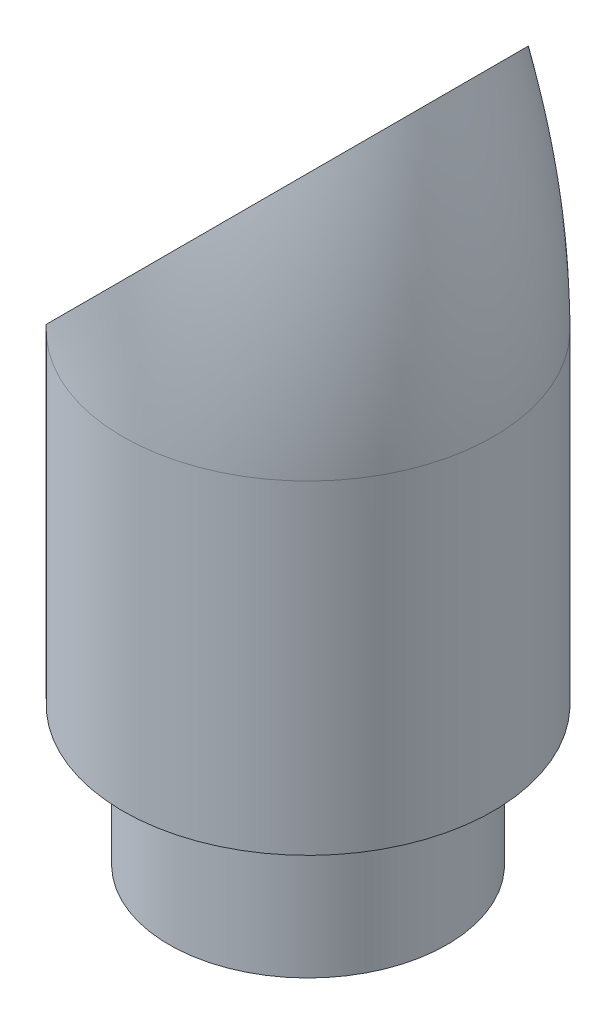
ISO-10303-21;
HEADER;
FILE_DESCRIPTION(('STEP AP214'),'2;1');
FILE_NAME('part.step','',(''),(''),'','','');
FILE_SCHEMA(('AUTOMOTIVE_DESIGN { 1 0 10303 214 1 1 1 1 }'));
ENDSEC;
DATA;
#1=APPLICATION_CONTEXT('core data for automotive mechanical design processes');
#2=APPLICATION_PROTOCOL_DEFINITION('international standard','automotive_design',2000,#1);
#3=PRODUCT_CONTEXT('',#1,'mechanical');
#4=PRODUCT('Part','Part','',(#3));
#5=PRODUCT_RELATED_PRODUCT_CATEGORY('part','',(#4));
#6=PRODUCT_DEFINITION_FORMATION('','',#4);
#7=PRODUCT_DEFINITION_CONTEXT('part definition',#1,'design');
#8=PRODUCT_DEFINITION('design','',#6,#7);
#9=PRODUCT_DEFINITION_SHAPE('','',#8);
#10=(LENGTH_UNIT() NAMED_UNIT(*) SI_UNIT(.MILLI.,.METRE.));
#11=(NAMED_UNIT(*) PLANE_ANGLE_UNIT() SI_UNIT($,.RADIAN.));
#12=(NAMED_UNIT(*) SI_UNIT($,.STERADIAN.) SOLID_ANGLE_UNIT());
#13=UNCERTAINTY_MEASURE_WITH_UNIT(LENGTH_MEASURE(1.E-05),#10,'distance_accuracy_value','');
#14=(GEOMETRIC_REPRESENTATION_CONTEXT(3) GLOBAL_UNCERTAINTY_ASSIGNED_CONTEXT((#13)) GLOBAL_UNIT_ASSIGNED_CONTEXT((#10,
#11,#12)) REPRESENTATION_CONTEXT('',''));
#15=CARTESIAN_POINT('',(0.,0.,0.));
#16=DIRECTION('',(0.,0.,1.));
#17=DIRECTION('',(1.,0.,0.));
#18=AXIS2_PLACEMENT_3D('',#15,#16,#17);
#19=CARTESIAN_POINT('',(0.,10.,0.));
#20=DIRECTION('',(0.,-1.,0.));
#21=DIRECTION('',(0.,0.,-1.));
#22=AXIS2_PLACEMENT_3D('',#19,#20,#21);
#23=PLANE('',#22);
#24=CARTESIAN_POINT('',(0.,10.,0.));
#25=DIRECTION('',(0.,-1.,0.));
#26=DIRECTION('',(0.,0.,-1.));
#27=AXIS2_PLACEMENT_3D('',#24,#25,#26);
#28=CIRCLE('',#27,1.6);
#29=CARTESIAN_POINT('',(0.,10.,-1.6));
#30=VERTEX_POINT('',#29);
#31=EDGE_CURVE('E82',#30,#30,#28,.T.);
#32=ORIENTED_EDGE('',*,*,#31,.T.);
#33=EDGE_LOOP('',(#32));
#34=FACE_BOUND('',#33,.T.);
#35=ADVANCED_FACE('F39',(#34),#23,.T.);
#36=CARTESIAN_POINT('',(0.,10.,0.));
#37=DIRECTION('',(0.,-1.,0.));
#38=DIRECTION('',(0.,0.,-1.));
#39=AXIS2_PLACEMENT_3D('',#36,#37,#38);
#40=CYLINDRICAL_SURFACE('',#39,1.6);
#41=ORIENTED_EDGE('',*,*,#31,.F.);
#42=EDGE_LOOP('',(#41));
#43=FACE_BOUND('',#42,.T.);
#44=CARTESIAN_POINT('',(0.,0.,0.));
#45=DIRECTION('',(0.,-1.,0.));
#46=DIRECTION('',(0.,0.,-1.));
#47=AXIS2_PLACEMENT_3D('',#44,#45,#46);
#48=CIRCLE('',#47,1.6);
#49=CARTESIAN_POINT('',(0.,0.,-1.6));
#50=VERTEX_POINT('',#49);
#51=EDGE_CURVE('E68',#50,#50,#48,.T.);
#52=ORIENTED_EDGE('',*,*,#51,.T.);
#53=EDGE_LOOP('',(#52));
#54=FACE_BOUND('',#53,.T.);
#55=ADVANCED_FACE('F94',(#43,#54),#40,.F.);
#56=CARTESIAN_POINT('',(0.,0.,0.));
#57=DIRECTION('',(0.,1.,0.));
#58=DIRECTION('',(0.,0.,1.));
#59=AXIS2_PLACEMENT_3D('',#56,#57,#58);
#60=PLANE('',#59);
#61=ORIENTED_EDGE('',*,*,#51,.F.);
#62=EDGE_LOOP('',(#61));
#63=FACE_BOUND('',#62,.T.);
#64=CARTESIAN_POINT('',(0.,0.,0.));
#65=DIRECTION('',(0.,-1.,0.));
#66=DIRECTION('',(0.,0.,-1.));
#67=AXIS2_PLACEMENT_3D('',#64,#65,#66);
#68=CIRCLE('',#67,3.);
#69=CARTESIAN_POINT('',(0.,0.,-3.));
#70=VERTEX_POINT('',#69);
#71=EDGE_CURVE('E78',#70,#70,#68,.T.);
#72=ORIENTED_EDGE('',*,*,#71,.T.);
#73=EDGE_LOOP('',(#72));
#74=FACE_BOUND('',#73,.T.);
#75=ADVANCED_FACE('F41',(#63,#74),#60,.F.);
#76=CARTESIAN_POINT('',(0.,3.,0.));
#77=DIRECTION('',(0.,-1.,0.));
#78=DIRECTION('',(0.,0.,-1.));
#79=AXIS2_PLACEMENT_3D('',#76,#77,#78);
#80=CYLINDRICAL_SURFACE('',#79,3.);
#81=CARTESIAN_POINT('',(0.,3.,0.));
#82=DIRECTION('',(0.,-1.,0.));
#83=DIRECTION('',(0.,0.,-1.));
#84=AXIS2_PLACEMENT_3D('',#81,#82,#83);
#85=CIRCLE('',#84,3.);
#86=CARTESIAN_POINT('',(0.,3.,-3.));
#87=VERTEX_POINT('',#86);
#88=EDGE_CURVE('E75',#87,#87,#85,.T.);
#89=ORIENTED_EDGE('',*,*,#88,.T.);
#90=EDGE_LOOP('',(#89));
#91=FACE_BOUND('',#90,.T.);
#92=ORIENTED_EDGE('',*,*,#71,.F.);
#93=EDGE_LOOP('',(#92));
#94=FACE_BOUND('',#93,.T.);
#95=ADVANCED_FACE('F102',(#91,#94),#80,.T.);
#96=CARTESIAN_POINT('',(0.,3.,0.));
#97=DIRECTION('',(0.,-1.,0.));
#98=DIRECTION('',(0.,0.,-1.));
#99=AXIS2_PLACEMENT_3D('',#96,#97,#98);
#100=PLANE('',#99);
#101=ORIENTED_EDGE('',*,*,#88,.F.);
#102=EDGE_LOOP('',(#101));
#103=FACE_BOUND('',#102,.T.);
#104=CARTESIAN_POINT('',(0.,3.,0.));
#105=DIRECTION('',(0.,-1.,0.));
#106=DIRECTION('',(0.,0.,-1.));
#107=AXIS2_PLACEMENT_3D('',#104,#105,#106);
#108=CIRCLE('',#107,4.);
#109=CARTESIAN_POINT('',(0.,3.,-4.));
#110=VERTEX_POINT('',#109);
#111=EDGE_CURVE('E72',#110,#110,#108,.T.);
#112=ORIENTED_EDGE('',*,*,#111,.T.);
#113=EDGE_LOOP('',(#112));
#114=FACE_BOUND('',#113,.T.);
#115=ADVANCED_FACE('F106',(#103,#114),#100,.T.);
#116=CARTESIAN_POINT('',(-10.,10.,0.));
#117=DIRECTION('',(0.,0.,1.));
#118=DIRECTION('',(1.,0.,0.));
#119=AXIS2_PLACEMENT_3D('',#116,#117,#118);
#120=TOROIDAL_SURFACE('',#119,10.,4.);
#121=CARTESIAN_POINT('',(-2.92913218813445,9.9998,2.72400158608706));
#122=CARTESIAN_POINT('',(-2.88158386871908,10.0473483194154,2.7751235192713));
#123=CARTESIAN_POINT('',(-2.83330709685542,10.095625091279,2.82487186485206));
#124=CARTESIAN_POINT('',(-2.73538819465078,10.1935439934837,2.92159553685329));
#125=CARTESIAN_POINT('',(-2.685746149424,10.2431860387104,2.96857103556741));
#126=CARTESIAN_POINT('',(-2.53490572031278,10.3940264678217,3.1053039532406));
#127=CARTESIAN_POINT('',(-2.43178798389395,10.4971442042405,3.19087321768191));
#128=CARTESIAN_POINT('',(-2.22042558816401,10.7085065999705,3.35088564511748));
#129=CARTESIAN_POINT('',(-2.11215064402035,10.8167815441141,3.42524856610438));
#130=CARTESIAN_POINT('',(-1.89173835735942,11.037193830775,3.56151658046738));
#131=CARTESIAN_POINT('',(-1.77960090920685,11.1493312789276,3.62342133280876));
#132=CARTESIAN_POINT('',(-1.54530934463143,11.383622843503,3.73731465571493));
#133=CARTESIAN_POINT('',(-1.42295682301914,11.5059753651153,3.78849099694701));
#134=CARTESIAN_POINT('',(-1.17548329287618,11.7534488952583,3.87500879943194));
#135=CARTESIAN_POINT('',(-1.05036257320204,11.8785696149324,3.91035190475291));
#136=CARTESIAN_POINT('',(-0.798664054347544,12.1302681337869,3.96412494210877));
#137=CARTESIAN_POINT('',(-0.672091353248427,12.256840834886,3.98260224268132));
#138=CARTESIAN_POINT('',(-0.418283668642859,12.5106485194916,4.00184224684836));
#139=CARTESIAN_POINT('',(-0.291048919216336,12.6378832689181,4.00261083560131));
#140=CARTESIAN_POINT('',(-0.068652101036781,12.8602800870977,3.98770779226967));
#141=CARTESIAN_POINT('',(0.026651577781745,12.9555837659162,3.97605930903689));
#142=CARTESIAN_POINT('',(0.216283358359402,13.1452155464939,3.94196996418251));
#143=CARTESIAN_POINT('',(0.310611651133643,13.2395438392681,3.91953125818385));
#144=CARTESIAN_POINT('',(0.49766152373884,13.4265937118733,3.86362840285947));
#145=CARTESIAN_POINT('',(0.590382517694651,13.5193147058291,3.83016031862292));
#146=CARTESIAN_POINT('',(0.773410462789536,13.702342650924,3.75209168535014));
#147=CARTESIAN_POINT('',(0.863718554557266,13.7926507426918,3.70749650322012));
#148=CARTESIAN_POINT('',(1.04172095477024,13.9706531429047,3.60685052347462));
#149=CARTESIAN_POINT('',(1.12939638958422,14.0583285777187,3.55073277535716));
#150=CARTESIAN_POINT('',(1.30069509479289,14.2296272829274,3.42735612085403));
#151=CARTESIAN_POINT('',(1.38432019025806,14.3132523783926,3.36010229386681));
#152=CARTESIAN_POINT('',(1.54669772416968,14.4756299123042,3.21471507728015));
#153=CARTESIAN_POINT('',(1.62545060011529,14.5543827882498,3.13658266657304));
#154=CARTESIAN_POINT('',(1.77722103118634,14.7061532193208,2.96987545736534));
#155=CARTESIAN_POINT('',(1.85023929160725,14.7791714797418,2.8813019463685));
#156=CARTESIAN_POINT('',(1.98241379018344,14.9113459783179,2.70408513615778));
#157=CARTESIAN_POINT('',(2.04222154951238,14.9711537376469,2.61641211041904));
#158=CARTESIAN_POINT('',(2.15595906234872,15.0848912504832,2.43375031968733));
#159=CARTESIAN_POINT('',(2.2098894805048,15.1388216686393,2.33876238399056));
#160=CARTESIAN_POINT('',(2.31129353089334,15.2402257190279,2.14218737374556));
#161=CARTESIAN_POINT('',(2.35877001629223,15.2877022044267,2.04060324479647));
#162=CARTESIAN_POINT('',(2.44677974377143,15.3757119319059,1.83158675937055));
#163=CARTESIAN_POINT('',(2.48731344243624,15.4162456305708,1.72415478808322));
#164=CARTESIAN_POINT('',(2.55786798678361,15.4868001749181,1.51363775564445));
#165=CARTESIAN_POINT('',(2.58848800992881,15.5174201980633,1.41095346133786));
#166=CARTESIAN_POINT('',(2.64324767036999,15.5721798585045,1.20214105494086));
#167=CARTESIAN_POINT('',(2.66738517481277,15.5963173629473,1.09601182225173));
#168=CARTESIAN_POINT('',(2.70891369961571,15.6378458877502,0.881218279840907));
#169=CARTESIAN_POINT('',(2.72630905218914,15.6552412403237,0.772555645725129));
#170=CARTESIAN_POINT('',(2.75420662958353,15.6831388177181,0.553431501953455));
#171=CARTESIAN_POINT('',(2.76470638119587,15.6936385693304,0.442969361419416));
#172=CARTESIAN_POINT('',(2.77837738569992,15.7073095738344,0.226225852343533));
#173=CARTESIAN_POINT('',(2.78186113319236,15.7107933213269,0.119983667962317));
#174=CARTESIAN_POINT('',(2.78241313861938,15.7113453267539,-0.0925732522418554));
#175=CARTESIAN_POINT('',(2.77947911250278,15.7084113006373,-0.198888000428563));
#176=CARTESIAN_POINT('',(2.76722053776811,15.6961527259026,-0.410726332607123));
#177=CARTESIAN_POINT('',(2.75789904447095,15.6868312326055,-0.516250270482169));
#178=CARTESIAN_POINT('',(2.73295106361706,15.6618832517516,-0.725834634159517));
#179=CARTESIAN_POINT('',(2.71732224622291,15.6462544343574,-0.829894504440631));
#180=CARTESIAN_POINT('',(2.6800942302071,15.6090264183416,-1.0347028516346));
#181=CARTESIAN_POINT('',(2.65855903106732,15.5874912192018,-1.13547455134927));
#182=CARTESIAN_POINT('',(2.60964607834053,15.538578266475,-1.33415279223178));
#183=CARTESIAN_POINT('',(2.58226622253591,15.5111984106704,-1.43205828803103));
#184=CARTESIAN_POINT('',(2.49170736547634,15.4206395536109,-1.72041258490721));
#185=CARTESIAN_POINT('',(2.4200714896984,15.3490036778329,-1.90570410185356));
#186=CARTESIAN_POINT('',(2.25493188373942,15.1838640718739,-2.26134650362618));
#187=CARTESIAN_POINT('',(2.16098214811302,15.0899143362475,-2.43127952610891));
#188=CARTESIAN_POINT('',(1.9551539335176,14.8840861216521,-2.74781474210799));
#189=CARTESIAN_POINT('',(1.84327234437422,14.7722045325087,-2.89441287951852));
#190=CARTESIAN_POINT('',(1.59866938794935,14.5276015760839,-3.16854455397865));
#191=CARTESIAN_POINT('',(1.46516215628635,14.3940943444209,-3.29467257106373));
#192=CARTESIAN_POINT('',(1.1859921661381,14.1149243542726,-3.51620646760122));
#193=CARTESIAN_POINT('',(1.04032566622048,13.969257854355,-3.61160284666137));
#194=CARTESIAN_POINT('',(0.728250643516532,13.657182831651,-3.77763612839992));
#195=CARTESIAN_POINT('',(0.561123668219778,13.4900558563543,-3.8455650903559));
#196=CARTESIAN_POINT('',(0.221610603233747,13.1505427913682,-3.94515610809312));
#197=CARTESIAN_POINT('',(0.0492230111352769,12.9781551992698,-3.97680770179299));
#198=CARTESIAN_POINT('',(-0.316565175889688,12.6123670122448,-4.00700052907749));
#199=CARTESIAN_POINT('',(-0.510134784507242,12.4187974036272,-4.00138664338646));
#200=CARTESIAN_POINT('',(-0.894648693344993,12.0342834947895,-3.95017483781599));
#201=CARTESIAN_POINT('',(-1.08559056327836,11.8433416248561,-3.90454213937303));
#202=CARTESIAN_POINT('',(-1.487677256622,11.4412549315125,-3.76776437083939));
#203=CARTESIAN_POINT('',(-1.697880984652,11.2310512034825,-3.67111550181158));
#204=CARTESIAN_POINT('',(-2.1058595461113,10.8230726420232,-3.43534051279573));
#205=CARTESIAN_POINT('',(-2.30364227631728,10.6252899118172,-3.29624171727975));
#206=CARTESIAN_POINT('',(-2.56869110600292,10.3602410821315,-3.07492592879239));
#207=CARTESIAN_POINT('',(-2.64287786671807,10.2860543214164,-3.00884839966487));
#208=CARTESIAN_POINT('',(-2.78826329918973,10.1406688889447,-2.87082291167029));
#209=CARTESIAN_POINT('',(-2.85946737816799,10.0694648099665,-2.79888633988227));
#210=CARTESIAN_POINT('',(-2.92913218813445,9.9998,-2.72400158608706));
#211=B_SPLINE_CURVE_WITH_KNOTS('',3,(#121,#122,#123,#124,#125,#126,#127,#128,#129,#130,#131,
#132,#133,#134,#135,#136,#137,#138,#139,#140,#141,#142,#143,#144,#145,#146,#147,#148,#149,#150,
#151,#152,#153,#154,#155,#156,#157,#158,#159,#160,#161,#162,#163,#164,#165,#166,#167,#168,#169,
#170,#171,#172,#173,#174,#175,#176,#177,#178,#179,#180,#181,#182,#183,#184,#185,#186,#187,#188,
#189,#190,#191,#192,#193,#194,#195,#196,#197,#198,#199,#200,#201,#202,#203,#204,#205,#206,#207,
#208,#209,#210),.UNSPECIFIED.,.F.,.F.,(4,2,2,2,2,2,2,2,2,2,2,2,2,2,2,2,2,2,2,2,2,2,2,2,2,2,2,2,
2,2,2,2,2,2,2,2,2,2,2,2,2,2,2,2,4),(0.,0.253370642160092,0.506725524270874,1.01340843011633,
1.52356265310228,2.03373083934824,2.57434425031388,3.11490151284597,3.65393587701449,
4.19279110063018,4.5982368740317,5.00360168290011,5.4091112691334,5.81442564372149,
6.22216530725435,6.62971950193072,7.03723704715331,7.44470439339559,7.80968501357462,
8.17462431640252,8.53940175785571,8.90415520091654,9.23806085281275,9.57207623083786,
9.90587662789214,10.2397966820752,10.5584822336437,10.8772812221426,11.1959278256839,
11.5146922407221,11.8301305139273,12.1456824363409,12.7761589726349,13.4204919941315,
14.0649368925746,14.7432257580068,15.4217241091872,16.1564662464067,16.8914202236729,
17.709597183205,18.5284858892089,19.4626818678851,20.3962777804389,20.768082448245,
21.1391810077165),.UNSPECIFIED.);
#212=CARTESIAN_POINT('',(-2.92893218813445,10.,2.72421662819056));
#213=VERTEX_POINT('',#212);
#214=CARTESIAN_POINT('',(-2.92893218813445,10.,-2.72421662819056));
#215=VERTEX_POINT('',#214);
#216=EDGE_CURVE('E11',#213,#215,#211,.T.);
#217=ORIENTED_EDGE('',*,*,#216,.F.);
#218=CARTESIAN_POINT('',(0.,10.,0.));
#219=DIRECTION('',(0.,1.,0.));
#220=DIRECTION('',(0.,0.,1.));
#221=AXIS2_PLACEMENT_3D('',#218,#219,#220);
#222=CIRCLE('',#221,4.);
#223=EDGE_CURVE('E53',#213,#215,#222,.T.);
#224=ORIENTED_EDGE('',*,*,#223,.T.);
#225=EDGE_LOOP('',(#217,#224));
#226=FACE_BOUND('',#225,.T.);
#227=ADVANCED_FACE('F70',(#226),#120,.T.);
#228=CARTESIAN_POINT('',(0.,0.,0.));
#229=DIRECTION('',(0.,1.,0.));
#230=DIRECTION('',(0.,0.,1.));
#231=AXIS2_PLACEMENT_3D('',#228,#229,#230);
#232=CYLINDRICAL_SURFACE('',#231,4.);
#233=CARTESIAN_POINT('',(0.,12.9289321881345,0.));
#234=DIRECTION('',(0.707106781186552,-0.707106781186543,0.));
#235=DIRECTION('',(0.707106781186543,0.707106781186552,0.));
#236=AXIS2_PLACEMENT_3D('',#233,#234,#235);
#237=ELLIPSE('',#236,5.65685424949242,4.);
#238=EDGE_CURVE('E62',#215,#213,#237,.F.);
#239=ORIENTED_EDGE('',*,*,#238,.F.);
#240=ORIENTED_EDGE('',*,*,#223,.F.);
#241=EDGE_LOOP('',(#239,#240));
#242=FACE_BOUND('',#241,.T.);
#243=ORIENTED_EDGE('',*,*,#111,.F.);
#244=EDGE_LOOP('',(#243));
#245=FACE_BOUND('',#244,.T.);
#246=ADVANCED_FACE('F65',(#242,#245),#232,.T.);
#247=CARTESIAN_POINT('',(12.214033914605,25.1429661027396,-4.));
#248=DIRECTION('',(0.707106781186552,-0.707106781186543,0.));
#249=DIRECTION('',(0.707106781186543,0.707106781186552,0.));
#250=AXIS2_PLACEMENT_3D('',#247,#248,#249);
#251=PLANE('',#250);
#252=ORIENTED_EDGE('',*,*,#238,.T.);
#253=ORIENTED_EDGE('',*,*,#216,.T.);
#254=EDGE_LOOP('',(#252,#253));
#255=FACE_BOUND('',#254,.T.);
#256=ADVANCED_FACE('F61',(#255),#251,.F.);
#257=CLOSED_SHELL('',(#35,#55,#75,#95,#115,#227,#246,#256));
#258=MANIFOLD_SOLID_BREP('B2',#257);
#259=ADVANCED_BREP_SHAPE_REPRESENTATION('',(#18,#258),#14);
#260=SHAPE_DEFINITION_REPRESENTATION(#9,#259);
ENDSEC;
END-ISO-10303-21;
